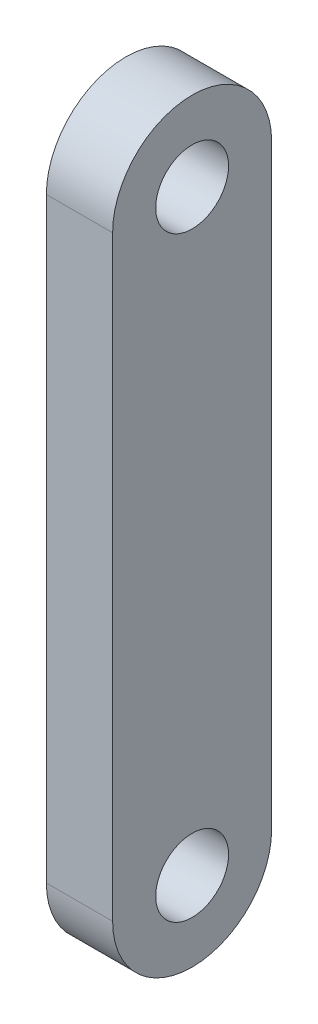
ISO-10303-21;
HEADER;
FILE_DESCRIPTION(('STEP AP214'),'2;1');
FILE_NAME('part.step','',(''),(''),'','','');
FILE_SCHEMA(('AUTOMOTIVE_DESIGN { 1 0 10303 214 1 1 1 1 }'));
ENDSEC;
DATA;
#1=APPLICATION_CONTEXT('core data for automotive mechanical design processes');
#2=APPLICATION_PROTOCOL_DEFINITION('international standard','automotive_design',2000,#1);
#3=PRODUCT_CONTEXT('',#1,'mechanical');
#4=PRODUCT('Part','Part','',(#3));
#5=PRODUCT_RELATED_PRODUCT_CATEGORY('part','',(#4));
#6=PRODUCT_DEFINITION_FORMATION('','',#4);
#7=PRODUCT_DEFINITION_CONTEXT('part definition',#1,'design');
#8=PRODUCT_DEFINITION('design','',#6,#7);
#9=PRODUCT_DEFINITION_SHAPE('','',#8);
#10=(LENGTH_UNIT() NAMED_UNIT(*) SI_UNIT(.MILLI.,.METRE.));
#11=(NAMED_UNIT(*) PLANE_ANGLE_UNIT() SI_UNIT($,.RADIAN.));
#12=(NAMED_UNIT(*) SI_UNIT($,.STERADIAN.) SOLID_ANGLE_UNIT());
#13=UNCERTAINTY_MEASURE_WITH_UNIT(LENGTH_MEASURE(1.E-05),#10,'distance_accuracy_value','');
#14=(GEOMETRIC_REPRESENTATION_CONTEXT(3) GLOBAL_UNCERTAINTY_ASSIGNED_CONTEXT((#13)) GLOBAL_UNIT_ASSIGNED_CONTEXT((#10,
#11,#12)) REPRESENTATION_CONTEXT('',''));
#15=CARTESIAN_POINT('',(0.,0.,0.));
#16=DIRECTION('',(0.,0.,1.));
#17=DIRECTION('',(1.,0.,0.));
#18=AXIS2_PLACEMENT_3D('',#15,#16,#17);
#19=CARTESIAN_POINT('',(5.,0.,0.));
#20=DIRECTION('',(1.,0.,0.));
#21=DIRECTION('',(0.,0.,-1.));
#22=AXIS2_PLACEMENT_3D('',#19,#20,#21);
#23=PLANE('',#22);
#24=CARTESIAN_POINT('',(5.,0.,0.));
#25=DIRECTION('',(1.,0.,0.));
#26=DIRECTION('',(0.,0.,-1.));
#27=AXIS2_PLACEMENT_3D('',#24,#25,#26);
#28=CIRCLE('',#27,2.75);
#29=CARTESIAN_POINT('',(5.,0.,-2.75));
#30=VERTEX_POINT('',#29);
#31=EDGE_CURVE('E106',#30,#30,#28,.T.);
#32=ORIENTED_EDGE('',*,*,#31,.F.);
#33=EDGE_LOOP('',(#32));
#34=FACE_BOUND('',#33,.T.);
#35=CARTESIAN_POINT('',(5.,0.,0.));
#36=DIRECTION('',(1.,0.,0.));
#37=DIRECTION('',(0.,0.,-1.));
#38=AXIS2_PLACEMENT_3D('',#35,#36,#37);
#39=CIRCLE('',#38,6.);
#40=CARTESIAN_POINT('',(5.,0.,6.));
#41=VERTEX_POINT('',#40);
#42=CARTESIAN_POINT('',(5.,0.,-6.));
#43=VERTEX_POINT('',#42);
#44=EDGE_CURVE('E91',#41,#43,#39,.T.);
#45=ORIENTED_EDGE('',*,*,#44,.T.);
#46=DIRECTION('',(0.,1.,0.));
#47=VECTOR('',#46,1.);
#48=CARTESIAN_POINT('',(5.,0.,-6.));
#49=LINE('',#48,#47);
#50=CARTESIAN_POINT('',(5.,45.,-6.));
#51=VERTEX_POINT('',#50);
#52=EDGE_CURVE('E86',#43,#51,#49,.T.);
#53=ORIENTED_EDGE('',*,*,#52,.T.);
#54=CARTESIAN_POINT('',(5.,45.,0.));
#55=DIRECTION('',(1.,0.,0.));
#56=DIRECTION('',(0.,0.,-1.));
#57=AXIS2_PLACEMENT_3D('',#54,#55,#56);
#58=CIRCLE('',#57,6.);
#59=CARTESIAN_POINT('',(5.,45.,6.));
#60=VERTEX_POINT('',#59);
#61=EDGE_CURVE('E89',#51,#60,#58,.T.);
#62=ORIENTED_EDGE('',*,*,#61,.T.);
#63=DIRECTION('',(0.,-1.,0.));
#64=VECTOR('',#63,1.);
#65=CARTESIAN_POINT('',(5.,0.,6.));
#66=LINE('',#65,#64);
#67=EDGE_CURVE('E56',#60,#41,#66,.T.);
#68=ORIENTED_EDGE('',*,*,#67,.T.);
#69=EDGE_LOOP('',(#45,#53,#62,#68));
#70=FACE_BOUND('',#69,.T.);
#71=CARTESIAN_POINT('',(5.,45.,0.));
#72=DIRECTION('',(1.,0.,0.));
#73=DIRECTION('',(0.,0.,-1.));
#74=AXIS2_PLACEMENT_3D('',#71,#72,#73);
#75=CIRCLE('',#74,2.75);
#76=CARTESIAN_POINT('',(5.,45.,-2.75));
#77=VERTEX_POINT('',#76);
#78=EDGE_CURVE('E121',#77,#77,#75,.T.);
#79=ORIENTED_EDGE('',*,*,#78,.F.);
#80=EDGE_LOOP('',(#79));
#81=FACE_BOUND('',#80,.T.);
#82=ADVANCED_FACE('F39',(#34,#70,#81),#23,.T.);
#83=CARTESIAN_POINT('',(0.,0.,0.));
#84=DIRECTION('',(1.,0.,0.));
#85=DIRECTION('',(0.,0.,-1.));
#86=AXIS2_PLACEMENT_3D('',#83,#84,#85);
#87=PLANE('',#86);
#88=CARTESIAN_POINT('',(0.,0.,0.));
#89=DIRECTION('',(1.,0.,0.));
#90=DIRECTION('',(0.,0.,-1.));
#91=AXIS2_PLACEMENT_3D('',#88,#89,#90);
#92=CIRCLE('',#91,6.);
#93=CARTESIAN_POINT('',(0.,0.,6.));
#94=VERTEX_POINT('',#93);
#95=CARTESIAN_POINT('',(0.,0.,-6.));
#96=VERTEX_POINT('',#95);
#97=EDGE_CURVE('E103',#94,#96,#92,.T.);
#98=ORIENTED_EDGE('',*,*,#97,.F.);
#99=DIRECTION('',(0.,-1.,0.));
#100=VECTOR('',#99,1.);
#101=CARTESIAN_POINT('',(0.,0.,6.));
#102=LINE('',#101,#100);
#103=CARTESIAN_POINT('',(0.,45.,6.));
#104=VERTEX_POINT('',#103);
#105=EDGE_CURVE('E79',#104,#94,#102,.T.);
#106=ORIENTED_EDGE('',*,*,#105,.F.);
#107=CARTESIAN_POINT('',(0.,45.,0.));
#108=DIRECTION('',(1.,0.,0.));
#109=DIRECTION('',(0.,0.,-1.));
#110=AXIS2_PLACEMENT_3D('',#107,#108,#109);
#111=CIRCLE('',#110,6.);
#112=CARTESIAN_POINT('',(0.,45.,-6.));
#113=VERTEX_POINT('',#112);
#114=EDGE_CURVE('E73',#113,#104,#111,.T.);
#115=ORIENTED_EDGE('',*,*,#114,.F.);
#116=DIRECTION('',(0.,1.,0.));
#117=VECTOR('',#116,1.);
#118=CARTESIAN_POINT('',(0.,0.,-6.));
#119=LINE('',#118,#117);
#120=EDGE_CURVE('E95',#96,#113,#119,.T.);
#121=ORIENTED_EDGE('',*,*,#120,.F.);
#122=EDGE_LOOP('',(#98,#106,#115,#121));
#123=FACE_BOUND('',#122,.T.);
#124=CARTESIAN_POINT('',(0.,0.,0.));
#125=DIRECTION('',(1.,0.,0.));
#126=DIRECTION('',(0.,0.,-1.));
#127=AXIS2_PLACEMENT_3D('',#124,#125,#126);
#128=CIRCLE('',#127,2.75);
#129=CARTESIAN_POINT('',(0.,0.,-2.75));
#130=VERTEX_POINT('',#129);
#131=EDGE_CURVE('E118',#130,#130,#128,.T.);
#132=ORIENTED_EDGE('',*,*,#131,.T.);
#133=EDGE_LOOP('',(#132));
#134=FACE_BOUND('',#133,.T.);
#135=CARTESIAN_POINT('',(0.,45.,0.));
#136=DIRECTION('',(1.,0.,0.));
#137=DIRECTION('',(0.,0.,-1.));
#138=AXIS2_PLACEMENT_3D('',#135,#136,#137);
#139=CIRCLE('',#138,2.75);
#140=CARTESIAN_POINT('',(0.,45.,-2.75));
#141=VERTEX_POINT('',#140);
#142=EDGE_CURVE('E124',#141,#141,#139,.T.);
#143=ORIENTED_EDGE('',*,*,#142,.T.);
#144=EDGE_LOOP('',(#143));
#145=FACE_BOUND('',#144,.T.);
#146=ADVANCED_FACE('F114',(#123,#134,#145),#87,.F.);
#147=CARTESIAN_POINT('',(5.,0.,0.));
#148=DIRECTION('',(-1.,0.,0.));
#149=DIRECTION('',(0.,0.,1.));
#150=AXIS2_PLACEMENT_3D('',#147,#148,#149);
#151=CYLINDRICAL_SURFACE('',#150,6.);
#152=ORIENTED_EDGE('',*,*,#97,.T.);
#153=DIRECTION('',(-1.,0.,0.));
#154=VECTOR('',#153,1.);
#155=CARTESIAN_POINT('',(5.,0.,-6.));
#156=LINE('',#155,#154);
#157=EDGE_CURVE('E11',#43,#96,#156,.T.);
#158=ORIENTED_EDGE('',*,*,#157,.F.);
#159=ORIENTED_EDGE('',*,*,#44,.F.);
#160=DIRECTION('',(-1.,0.,0.));
#161=VECTOR('',#160,1.);
#162=CARTESIAN_POINT('',(5.,0.,6.));
#163=LINE('',#162,#161);
#164=EDGE_CURVE('E99',#41,#94,#163,.T.);
#165=ORIENTED_EDGE('',*,*,#164,.T.);
#166=EDGE_LOOP('',(#152,#158,#159,#165));
#167=FACE_BOUND('',#166,.T.);
#168=ADVANCED_FACE('F41',(#167),#151,.T.);
#169=CARTESIAN_POINT('',(5.,0.,-6.));
#170=DIRECTION('',(0.,0.,1.));
#171=DIRECTION('',(0.,-1.,0.));
#172=AXIS2_PLACEMENT_3D('',#169,#170,#171);
#173=PLANE('',#172);
#174=ORIENTED_EDGE('',*,*,#120,.T.);
#175=DIRECTION('',(-1.,0.,0.));
#176=VECTOR('',#175,1.);
#177=CARTESIAN_POINT('',(5.,45.,-6.));
#178=LINE('',#177,#176);
#179=EDGE_CURVE('E48',#51,#113,#178,.T.);
#180=ORIENTED_EDGE('',*,*,#179,.F.);
#181=ORIENTED_EDGE('',*,*,#52,.F.);
#182=ORIENTED_EDGE('',*,*,#157,.T.);
#183=EDGE_LOOP('',(#174,#180,#181,#182));
#184=FACE_BOUND('',#183,.T.);
#185=ADVANCED_FACE('F94',(#184),#173,.F.);
#186=CARTESIAN_POINT('',(5.,45.,0.));
#187=DIRECTION('',(-1.,0.,0.));
#188=DIRECTION('',(0.,0.,1.));
#189=AXIS2_PLACEMENT_3D('',#186,#187,#188);
#190=CYLINDRICAL_SURFACE('',#189,6.);
#191=ORIENTED_EDGE('',*,*,#114,.T.);
#192=DIRECTION('',(-1.,0.,0.));
#193=VECTOR('',#192,1.);
#194=CARTESIAN_POINT('',(5.,45.,6.));
#195=LINE('',#194,#193);
#196=EDGE_CURVE('E96',#60,#104,#195,.T.);
#197=ORIENTED_EDGE('',*,*,#196,.F.);
#198=ORIENTED_EDGE('',*,*,#61,.F.);
#199=ORIENTED_EDGE('',*,*,#179,.T.);
#200=EDGE_LOOP('',(#191,#197,#198,#199));
#201=FACE_BOUND('',#200,.T.);
#202=ADVANCED_FACE('F97',(#201),#190,.T.);
#203=CARTESIAN_POINT('',(5.,0.,6.));
#204=DIRECTION('',(0.,0.,-1.));
#205=DIRECTION('',(0.,1.,0.));
#206=AXIS2_PLACEMENT_3D('',#203,#204,#205);
#207=PLANE('',#206);
#208=ORIENTED_EDGE('',*,*,#105,.T.);
#209=ORIENTED_EDGE('',*,*,#164,.F.);
#210=ORIENTED_EDGE('',*,*,#67,.F.);
#211=ORIENTED_EDGE('',*,*,#196,.T.);
#212=EDGE_LOOP('',(#208,#209,#210,#211));
#213=FACE_BOUND('',#212,.T.);
#214=ADVANCED_FACE('F111',(#213),#207,.F.);
#215=CARTESIAN_POINT('',(5.,0.,0.));
#216=DIRECTION('',(-1.,0.,0.));
#217=DIRECTION('',(0.,0.,1.));
#218=AXIS2_PLACEMENT_3D('',#215,#216,#217);
#219=CYLINDRICAL_SURFACE('',#218,2.75);
#220=ORIENTED_EDGE('',*,*,#31,.T.);
#221=EDGE_LOOP('',(#220));
#222=FACE_BOUND('',#221,.T.);
#223=ORIENTED_EDGE('',*,*,#131,.F.);
#224=EDGE_LOOP('',(#223));
#225=FACE_BOUND('',#224,.T.);
#226=ADVANCED_FACE('F141',(#222,#225),#219,.F.);
#227=CARTESIAN_POINT('',(5.,45.,0.));
#228=DIRECTION('',(-1.,0.,0.));
#229=DIRECTION('',(0.,0.,1.));
#230=AXIS2_PLACEMENT_3D('',#227,#228,#229);
#231=CYLINDRICAL_SURFACE('',#230,2.75);
#232=ORIENTED_EDGE('',*,*,#78,.T.);
#233=EDGE_LOOP('',(#232));
#234=FACE_BOUND('',#233,.T.);
#235=ORIENTED_EDGE('',*,*,#142,.F.);
#236=EDGE_LOOP('',(#235));
#237=FACE_BOUND('',#236,.T.);
#238=ADVANCED_FACE('F130',(#234,#237),#231,.F.);
#239=CLOSED_SHELL('',(#82,#146,#168,#185,#202,#214,#226,#238));
#240=MANIFOLD_SOLID_BREP('B2',#239);
#241=ADVANCED_BREP_SHAPE_REPRESENTATION('',(#18,#240),#14);
#242=SHAPE_DEFINITION_REPRESENTATION(#9,#241);
ENDSEC;
END-ISO-10303-21;
